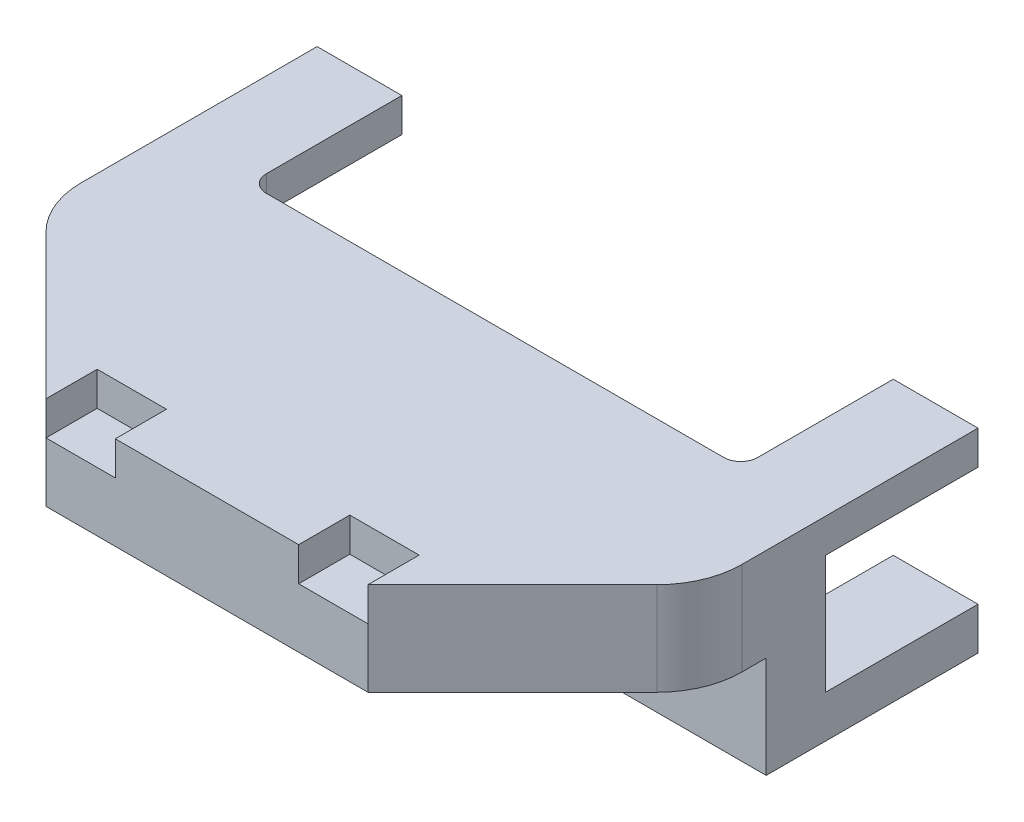
ISO-10303-21;
HEADER;
FILE_DESCRIPTION(('STEP AP214'),'2;1');
FILE_NAME('part.step','',(''),(''),'','','');
FILE_SCHEMA(('AUTOMOTIVE_DESIGN { 1 0 10303 214 1 1 1 1 }'));
ENDSEC;
DATA;
#1=APPLICATION_CONTEXT('core data for automotive mechanical design processes');
#2=APPLICATION_PROTOCOL_DEFINITION('international standard','automotive_design',2000,#1);
#3=PRODUCT_CONTEXT('',#1,'mechanical');
#4=PRODUCT('Part','Part','',(#3));
#5=PRODUCT_RELATED_PRODUCT_CATEGORY('part','',(#4));
#6=PRODUCT_DEFINITION_FORMATION('','',#4);
#7=PRODUCT_DEFINITION_CONTEXT('part definition',#1,'design');
#8=PRODUCT_DEFINITION('design','',#6,#7);
#9=PRODUCT_DEFINITION_SHAPE('','',#8);
#10=(LENGTH_UNIT() NAMED_UNIT(*) SI_UNIT(.MILLI.,.METRE.));
#11=(NAMED_UNIT(*) PLANE_ANGLE_UNIT() SI_UNIT($,.RADIAN.));
#12=(NAMED_UNIT(*) SI_UNIT($,.STERADIAN.) SOLID_ANGLE_UNIT());
#13=UNCERTAINTY_MEASURE_WITH_UNIT(LENGTH_MEASURE(1.E-05),#10,'distance_accuracy_value','');
#14=(GEOMETRIC_REPRESENTATION_CONTEXT(3) GLOBAL_UNCERTAINTY_ASSIGNED_CONTEXT((#13)) GLOBAL_UNIT_ASSIGNED_CONTEXT((#10,
#11,#12)) REPRESENTATION_CONTEXT('',''));
#15=CARTESIAN_POINT('',(0.,0.,0.));
#16=DIRECTION('',(0.,0.,1.));
#17=DIRECTION('',(1.,0.,0.));
#18=AXIS2_PLACEMENT_3D('',#15,#16,#17);
#19=CARTESIAN_POINT('',(34.,0.,4.92893218813449));
#20=DIRECTION('',(0.,1.,0.));
#21=DIRECTION('',(0.,0.,1.));
#22=AXIS2_PLACEMENT_3D('',#19,#20,#21);
#23=CYLINDRICAL_SURFACE('',#22,5.);
#24=DIRECTION('',(0.,-1.,0.));
#25=VECTOR('',#24,1.);
#26=CARTESIAN_POINT('',(39.,0.,4.92893218813449));
#27=LINE('',#26,#25);
#28=CARTESIAN_POINT('',(39.,0.,4.92893218813449));
#29=VERTEX_POINT('',#28);
#30=CARTESIAN_POINT('',(39.,-5.5,4.92893218813449));
#31=VERTEX_POINT('',#30);
#32=EDGE_CURVE('E501',#29,#31,#27,.T.);
#33=ORIENTED_EDGE('',*,*,#32,.F.);
#34=CARTESIAN_POINT('',(34.,0.,4.92893218813449));
#35=DIRECTION('',(0.,-1.,0.));
#36=DIRECTION('',(0.,0.,-1.));
#37=AXIS2_PLACEMENT_3D('',#34,#35,#36);
#38=CIRCLE('',#37,5.);
#39=CARTESIAN_POINT('',(37.5355339059327,0.,8.46446609406723));
#40=VERTEX_POINT('',#39);
#41=EDGE_CURVE('E42',#40,#29,#38,.F.);
#42=ORIENTED_EDGE('',*,*,#41,.F.);
#43=DIRECTION('',(0.,-1.,0.));
#44=VECTOR('',#43,1.);
#45=CARTESIAN_POINT('',(37.5355339059327,0.,8.46446609406722));
#46=LINE('',#45,#44);
#47=CARTESIAN_POINT('',(37.5355339059327,-5.5,8.46446609406723));
#48=VERTEX_POINT('',#47);
#49=EDGE_CURVE('E504',#48,#40,#46,.F.);
#50=ORIENTED_EDGE('',*,*,#49,.F.);
#51=CARTESIAN_POINT('',(34.,-5.5,4.92893218813449));
#52=DIRECTION('',(0.,-1.,0.));
#53=DIRECTION('',(0.,0.,-1.));
#54=AXIS2_PLACEMENT_3D('',#51,#52,#53);
#55=CIRCLE('',#54,5.);
#56=EDGE_CURVE('E11',#31,#48,#55,.T.);
#57=ORIENTED_EDGE('',*,*,#56,.F.);
#58=EDGE_LOOP('',(#33,#42,#50,#57));
#59=FACE_BOUND('',#58,.T.);
#60=ADVANCED_FACE('F35',(#59),#23,.T.);
#61=CARTESIAN_POINT('',(5.,0.,4.9289321881345));
#62=DIRECTION('',(0.,1.,0.));
#63=DIRECTION('',(-1.,0.,0.));
#64=AXIS2_PLACEMENT_3D('',#61,#62,#63);
#65=CYLINDRICAL_SURFACE('',#64,5.);
#66=DIRECTION('',(0.,-1.,0.));
#67=VECTOR('',#66,1.);
#68=CARTESIAN_POINT('',(1.46446609406726,0.,8.46446609406723));
#69=LINE('',#68,#67);
#70=CARTESIAN_POINT('',(1.46446609406726,0.,8.46446609406723));
#71=VERTEX_POINT('',#70);
#72=CARTESIAN_POINT('',(1.46446609406726,-5.5,8.46446609406723));
#73=VERTEX_POINT('',#72);
#74=EDGE_CURVE('E493',#71,#73,#69,.T.);
#75=ORIENTED_EDGE('',*,*,#74,.F.);
#76=CARTESIAN_POINT('',(5.,0.,4.9289321881345));
#77=DIRECTION('',(0.,-1.,0.));
#78=DIRECTION('',(0.,0.,-1.));
#79=AXIS2_PLACEMENT_3D('',#76,#77,#78);
#80=CIRCLE('',#79,5.);
#81=CARTESIAN_POINT('',(0.,0.,4.92893218813449));
#82=VERTEX_POINT('',#81);
#83=EDGE_CURVE('E498',#82,#71,#80,.F.);
#84=ORIENTED_EDGE('',*,*,#83,.F.);
#85=DIRECTION('',(0.,-1.,0.));
#86=VECTOR('',#85,1.);
#87=CARTESIAN_POINT('',(0.,0.,4.9289321881345));
#88=LINE('',#87,#86);
#89=CARTESIAN_POINT('',(0.,-5.5,4.92893218813449));
#90=VERTEX_POINT('',#89);
#91=EDGE_CURVE('E496',#90,#82,#88,.F.);
#92=ORIENTED_EDGE('',*,*,#91,.F.);
#93=CARTESIAN_POINT('',(5.,-5.5,4.9289321881345));
#94=DIRECTION('',(0.,-1.,0.));
#95=DIRECTION('',(0.,0.,-1.));
#96=AXIS2_PLACEMENT_3D('',#93,#94,#95);
#97=CIRCLE('',#96,5.);
#98=EDGE_CURVE('E251',#73,#90,#97,.T.);
#99=ORIENTED_EDGE('',*,*,#98,.F.);
#100=EDGE_LOOP('',(#75,#84,#92,#99));
#101=FACE_BOUND('',#100,.T.);
#102=ADVANCED_FACE('F550',(#101),#65,.T.);
#103=CARTESIAN_POINT('',(0.,0.,17.));
#104=DIRECTION('',(0.,0.,1.));
#105=DIRECTION('',(1.,0.,0.));
#106=AXIS2_PLACEMENT_3D('',#103,#104,#105);
#107=PLANE('',#106);
#108=DIRECTION('',(0.,-1.,0.));
#109=VECTOR('',#108,1.);
#110=CARTESIAN_POINT('',(10.,-11.5,17.));
#111=LINE('',#110,#109);
#112=CARTESIAN_POINT('',(10.,-2.,17.));
#113=VERTEX_POINT('',#112);
#114=CARTESIAN_POINT('',(10.,-5.5,17.));
#115=VERTEX_POINT('',#114);
#116=EDGE_CURVE('E485',#113,#115,#111,.T.);
#117=ORIENTED_EDGE('',*,*,#116,.T.);
#118=DIRECTION('',(1.,0.,0.));
#119=VECTOR('',#118,1.);
#120=CARTESIAN_POINT('',(0.,-5.5,17.));
#121=LINE('',#120,#119);
#122=CARTESIAN_POINT('',(29.,-5.5,17.));
#123=VERTEX_POINT('',#122);
#124=EDGE_CURVE('E269',#115,#123,#121,.T.);
#125=ORIENTED_EDGE('',*,*,#124,.T.);
#126=DIRECTION('',(0.,1.,0.));
#127=VECTOR('',#126,1.);
#128=CARTESIAN_POINT('',(29.,0.,17.));
#129=LINE('',#128,#127);
#130=CARTESIAN_POINT('',(29.,-2.,17.));
#131=VERTEX_POINT('',#130);
#132=EDGE_CURVE('E480',#123,#131,#129,.T.);
#133=ORIENTED_EDGE('',*,*,#132,.T.);
#134=DIRECTION('',(1.,0.,0.));
#135=VECTOR('',#134,1.);
#136=CARTESIAN_POINT('',(29.,-2.,17.));
#137=LINE('',#136,#135);
#138=CARTESIAN_POINT('',(24.91,-2.,17.));
#139=VERTEX_POINT('',#138);
#140=EDGE_CURVE('E291',#139,#131,#137,.T.);
#141=ORIENTED_EDGE('',*,*,#140,.F.);
#142=DIRECTION('',(0.,1.,0.));
#143=VECTOR('',#142,1.);
#144=CARTESIAN_POINT('',(24.91,-2.,17.));
#145=LINE('',#144,#143);
#146=CARTESIAN_POINT('',(24.91,0.,17.));
#147=VERTEX_POINT('',#146);
#148=EDGE_CURVE('E306',#139,#147,#145,.T.);
#149=ORIENTED_EDGE('',*,*,#148,.T.);
#150=DIRECTION('',(-1.,0.,0.));
#151=VECTOR('',#150,1.);
#152=CARTESIAN_POINT('',(0.,0.,17.));
#153=LINE('',#152,#151);
#154=CARTESIAN_POINT('',(14.09,0.,17.));
#155=VERTEX_POINT('',#154);
#156=EDGE_CURVE('E418',#147,#155,#153,.T.);
#157=ORIENTED_EDGE('',*,*,#156,.T.);
#158=DIRECTION('',(0.,1.,0.));
#159=VECTOR('',#158,1.);
#160=CARTESIAN_POINT('',(14.09,-2.,17.));
#161=LINE('',#160,#159);
#162=CARTESIAN_POINT('',(14.09,-2.,17.));
#163=VERTEX_POINT('',#162);
#164=EDGE_CURVE('E325',#163,#155,#161,.T.);
#165=ORIENTED_EDGE('',*,*,#164,.F.);
#166=DIRECTION('',(1.,0.,0.));
#167=VECTOR('',#166,1.);
#168=CARTESIAN_POINT('',(10.,-2.,17.));
#169=LINE('',#168,#167);
#170=EDGE_CURVE('E315',#113,#163,#169,.T.);
#171=ORIENTED_EDGE('',*,*,#170,.F.);
#172=EDGE_LOOP('',(#117,#125,#133,#141,#149,#157,#165,#171));
#173=FACE_BOUND('',#172,.T.);
#174=ADVANCED_FACE('F571',(#173),#107,.T.);
#175=CARTESIAN_POINT('',(29.,0.,17.));
#176=DIRECTION('',(0.707106781186549,0.,0.707106781186546));
#177=DIRECTION('',(0.,-1.,0.));
#178=AXIS2_PLACEMENT_3D('',#175,#176,#177);
#179=PLANE('',#178);
#180=DIRECTION('',(0.707106781186546,0.,-0.707106781186549));
#181=VECTOR('',#180,1.);
#182=CARTESIAN_POINT('',(29.,-5.5,17.));
#183=LINE('',#182,#181);
#184=EDGE_CURVE('E272',#123,#48,#183,.T.);
#185=ORIENTED_EDGE('',*,*,#184,.T.);
#186=ORIENTED_EDGE('',*,*,#49,.T.);
#187=DIRECTION('',(0.707106781186546,0.,-0.707106781186549));
#188=VECTOR('',#187,1.);
#189=CARTESIAN_POINT('',(29.,0.,17.));
#190=LINE('',#189,#188);
#191=CARTESIAN_POINT('',(29.,0.,17.));
#192=VERTEX_POINT('',#191);
#193=EDGE_CURVE('E482',#192,#40,#190,.T.);
#194=ORIENTED_EDGE('',*,*,#193,.F.);
#195=DIRECTION('',(0.,1.,0.));
#196=VECTOR('',#195,1.);
#197=CARTESIAN_POINT('',(29.,-2.,17.));
#198=LINE('',#197,#196);
#199=EDGE_CURVE('E303',#131,#192,#198,.T.);
#200=ORIENTED_EDGE('',*,*,#199,.F.);
#201=ORIENTED_EDGE('',*,*,#132,.F.);
#202=EDGE_LOOP('',(#185,#186,#194,#200,#201));
#203=FACE_BOUND('',#202,.T.);
#204=ADVANCED_FACE('F587',(#203),#179,.T.);
#205=CARTESIAN_POINT('',(10.,0.,17.));
#206=DIRECTION('',(-0.707106781186549,0.,0.707106781186546));
#207=DIRECTION('',(0.,1.,0.));
#208=AXIS2_PLACEMENT_3D('',#205,#206,#207);
#209=PLANE('',#208);
#210=DIRECTION('',(0.707106781186546,0.,0.707106781186549));
#211=VECTOR('',#210,1.);
#212=CARTESIAN_POINT('',(10.,0.,17.));
#213=LINE('',#212,#211);
#214=CARTESIAN_POINT('',(10.,0.,17.));
#215=VERTEX_POINT('',#214);
#216=EDGE_CURVE('E488',#71,#215,#213,.T.);
#217=ORIENTED_EDGE('',*,*,#216,.F.);
#218=ORIENTED_EDGE('',*,*,#74,.T.);
#219=DIRECTION('',(0.707106781186546,0.,0.707106781186549));
#220=VECTOR('',#219,1.);
#221=CARTESIAN_POINT('',(10.,-5.5,17.));
#222=LINE('',#221,#220);
#223=EDGE_CURVE('E490',#73,#115,#222,.T.);
#224=ORIENTED_EDGE('',*,*,#223,.T.);
#225=ORIENTED_EDGE('',*,*,#116,.F.);
#226=EDGE_CURVE('E486',#215,#113,#111,.T.);
#227=ORIENTED_EDGE('',*,*,#226,.F.);
#228=EDGE_LOOP('',(#217,#218,#224,#225,#227));
#229=FACE_BOUND('',#228,.T.);
#230=ADVANCED_FACE('F554',(#229),#209,.T.);
#231=CARTESIAN_POINT('',(6.,-11.5,-0.999999999999999));
#232=DIRECTION('',(0.,1.,0.));
#233=DIRECTION('',(0.,0.,1.));
#234=AXIS2_PLACEMENT_3D('',#231,#232,#233);
#235=CYLINDRICAL_SURFACE('',#234,1.);
#236=DIRECTION('',(0.,-1.,0.));
#237=VECTOR('',#236,1.);
#238=CARTESIAN_POINT('',(5.,-11.5,-0.999999999999999));
#239=LINE('',#238,#237);
#240=CARTESIAN_POINT('',(5.,-9.,-1.));
#241=VERTEX_POINT('',#240);
#242=CARTESIAN_POINT('',(5.,-11.5,-1.));
#243=VERTEX_POINT('',#242);
#244=EDGE_CURVE('E469',#241,#243,#239,.T.);
#245=ORIENTED_EDGE('',*,*,#244,.F.);
#246=CARTESIAN_POINT('',(6.,-9.,-0.999999999999999));
#247=DIRECTION('',(0.,-1.,0.));
#248=DIRECTION('',(1.,0.,0.));
#249=AXIS2_PLACEMENT_3D('',#246,#247,#248);
#250=CIRCLE('',#249,1.);
#251=CARTESIAN_POINT('',(6.,-9.,0.));
#252=VERTEX_POINT('',#251);
#253=EDGE_CURVE('E475',#241,#252,#250,.F.);
#254=ORIENTED_EDGE('',*,*,#253,.T.);
#255=DIRECTION('',(0.,-1.,0.));
#256=VECTOR('',#255,1.);
#257=CARTESIAN_POINT('',(6.,-11.5,0.));
#258=LINE('',#257,#256);
#259=CARTESIAN_POINT('',(6.,-11.5,0.));
#260=VERTEX_POINT('',#259);
#261=EDGE_CURVE('E472',#260,#252,#258,.F.);
#262=ORIENTED_EDGE('',*,*,#261,.F.);
#263=CARTESIAN_POINT('',(6.,-11.5,-0.999999999999999));
#264=DIRECTION('',(0.,1.,0.));
#265=DIRECTION('',(0.,0.,1.));
#266=AXIS2_PLACEMENT_3D('',#263,#264,#265);
#267=CIRCLE('',#266,1.);
#268=EDGE_CURVE('E478',#260,#243,#267,.F.);
#269=ORIENTED_EDGE('',*,*,#268,.T.);
#270=EDGE_LOOP('',(#245,#254,#262,#269));
#271=FACE_BOUND('',#270,.T.);
#272=ADVANCED_FACE('F614',(#271),#235,.F.);
#273=CARTESIAN_POINT('',(33.,-11.5,-0.999999999999999));
#274=DIRECTION('',(0.,-1.,0.));
#275=DIRECTION('',(0.,0.,-1.));
#276=AXIS2_PLACEMENT_3D('',#273,#274,#275);
#277=CYLINDRICAL_SURFACE('',#276,1.);
#278=DIRECTION('',(0.,1.,0.));
#279=VECTOR('',#278,1.);
#280=CARTESIAN_POINT('',(34.,-11.5,-0.999999999999999));
#281=LINE('',#280,#279);
#282=CARTESIAN_POINT('',(34.,-11.5,-1.));
#283=VERTEX_POINT('',#282);
#284=CARTESIAN_POINT('',(34.,-9.,-1.));
#285=VERTEX_POINT('',#284);
#286=EDGE_CURVE('E458',#283,#285,#281,.T.);
#287=ORIENTED_EDGE('',*,*,#286,.F.);
#288=CARTESIAN_POINT('',(33.,-11.5,-0.999999999999999));
#289=DIRECTION('',(0.,1.,0.));
#290=DIRECTION('',(0.,0.,1.));
#291=AXIS2_PLACEMENT_3D('',#288,#289,#290);
#292=CIRCLE('',#291,1.);
#293=CARTESIAN_POINT('',(33.,-11.5,0.));
#294=VERTEX_POINT('',#293);
#295=EDGE_CURVE('E464',#283,#294,#292,.F.);
#296=ORIENTED_EDGE('',*,*,#295,.T.);
#297=DIRECTION('',(0.,1.,0.));
#298=VECTOR('',#297,1.);
#299=CARTESIAN_POINT('',(33.,-11.5,0.));
#300=LINE('',#299,#298);
#301=CARTESIAN_POINT('',(33.,-9.,0.));
#302=VERTEX_POINT('',#301);
#303=EDGE_CURVE('E461',#302,#294,#300,.F.);
#304=ORIENTED_EDGE('',*,*,#303,.F.);
#305=CARTESIAN_POINT('',(33.,-9.,-0.999999999999999));
#306=DIRECTION('',(0.,-1.,0.));
#307=DIRECTION('',(0.,0.,-1.));
#308=AXIS2_PLACEMENT_3D('',#305,#306,#307);
#309=CIRCLE('',#308,1.);
#310=EDGE_CURVE('E467',#302,#285,#309,.F.);
#311=ORIENTED_EDGE('',*,*,#310,.T.);
#312=EDGE_LOOP('',(#287,#296,#304,#311));
#313=FACE_BOUND('',#312,.T.);
#314=ADVANCED_FACE('F619',(#313),#277,.F.);
#315=CARTESIAN_POINT('',(6.,0.,-1.));
#316=DIRECTION('',(0.,-1.,0.));
#317=DIRECTION('',(1.,0.,0.));
#318=AXIS2_PLACEMENT_3D('',#315,#316,#317);
#319=CYLINDRICAL_SURFACE('',#318,1.);
#320=DIRECTION('',(0.,1.,0.));
#321=VECTOR('',#320,1.);
#322=CARTESIAN_POINT('',(6.,0.,0.));
#323=LINE('',#322,#321);
#324=CARTESIAN_POINT('',(6.,-2.,0.));
#325=VERTEX_POINT('',#324);
#326=CARTESIAN_POINT('',(6.,0.,0.));
#327=VERTEX_POINT('',#326);
#328=EDGE_CURVE('E448',#325,#327,#323,.T.);
#329=ORIENTED_EDGE('',*,*,#328,.F.);
#330=CARTESIAN_POINT('',(6.,-2.,-1.));
#331=DIRECTION('',(0.,1.,0.));
#332=DIRECTION('',(-1.,0.,0.));
#333=AXIS2_PLACEMENT_3D('',#330,#331,#332);
#334=CIRCLE('',#333,1.);
#335=CARTESIAN_POINT('',(5.,-2.,-1.));
#336=VERTEX_POINT('',#335);
#337=EDGE_CURVE('E454',#325,#336,#334,.F.);
#338=ORIENTED_EDGE('',*,*,#337,.T.);
#339=DIRECTION('',(0.,1.,0.));
#340=VECTOR('',#339,1.);
#341=CARTESIAN_POINT('',(5.,0.,-1.));
#342=LINE('',#341,#340);
#343=CARTESIAN_POINT('',(5.,0.,-1.));
#344=VERTEX_POINT('',#343);
#345=EDGE_CURVE('E451',#344,#336,#342,.F.);
#346=ORIENTED_EDGE('',*,*,#345,.F.);
#347=CARTESIAN_POINT('',(6.,0.,-1.));
#348=DIRECTION('',(0.,-1.,0.));
#349=DIRECTION('',(0.,0.,-1.));
#350=AXIS2_PLACEMENT_3D('',#347,#348,#349);
#351=CIRCLE('',#350,1.);
#352=EDGE_CURVE('E456',#344,#327,#351,.F.);
#353=ORIENTED_EDGE('',*,*,#352,.T.);
#354=EDGE_LOOP('',(#329,#338,#346,#353));
#355=FACE_BOUND('',#354,.T.);
#356=ADVANCED_FACE('F537',(#355),#319,.F.);
#357=CARTESIAN_POINT('',(33.,0.,-0.999999999999999));
#358=DIRECTION('',(0.,-1.,0.));
#359=DIRECTION('',(0.,0.,-1.));
#360=AXIS2_PLACEMENT_3D('',#357,#358,#359);
#361=CYLINDRICAL_SURFACE('',#360,1.);
#362=DIRECTION('',(0.,1.,0.));
#363=VECTOR('',#362,1.);
#364=CARTESIAN_POINT('',(34.,0.,-0.999999999999999));
#365=LINE('',#364,#363);
#366=CARTESIAN_POINT('',(34.,-2.,-1.));
#367=VERTEX_POINT('',#366);
#368=CARTESIAN_POINT('',(34.,0.,-1.));
#369=VERTEX_POINT('',#368);
#370=EDGE_CURVE('E437',#367,#369,#365,.T.);
#371=ORIENTED_EDGE('',*,*,#370,.F.);
#372=CARTESIAN_POINT('',(33.,-2.,-0.999999999999999));
#373=DIRECTION('',(0.,1.,0.));
#374=DIRECTION('',(0.,0.,1.));
#375=AXIS2_PLACEMENT_3D('',#372,#373,#374);
#376=CIRCLE('',#375,1.);
#377=CARTESIAN_POINT('',(33.,-2.,0.));
#378=VERTEX_POINT('',#377);
#379=EDGE_CURVE('E443',#367,#378,#376,.F.);
#380=ORIENTED_EDGE('',*,*,#379,.T.);
#381=DIRECTION('',(0.,1.,0.));
#382=VECTOR('',#381,1.);
#383=CARTESIAN_POINT('',(33.,0.,0.));
#384=LINE('',#383,#382);
#385=CARTESIAN_POINT('',(33.,0.,0.));
#386=VERTEX_POINT('',#385);
#387=EDGE_CURVE('E440',#386,#378,#384,.F.);
#388=ORIENTED_EDGE('',*,*,#387,.F.);
#389=CARTESIAN_POINT('',(33.,0.,-0.999999999999999));
#390=DIRECTION('',(0.,-1.,0.));
#391=DIRECTION('',(0.,0.,-1.));
#392=AXIS2_PLACEMENT_3D('',#389,#390,#391);
#393=CIRCLE('',#392,1.);
#394=EDGE_CURVE('E446',#386,#369,#393,.F.);
#395=ORIENTED_EDGE('',*,*,#394,.T.);
#396=EDGE_LOOP('',(#371,#380,#388,#395));
#397=FACE_BOUND('',#396,.T.);
#398=ADVANCED_FACE('F525',(#397),#361,.F.);
#399=CARTESIAN_POINT('',(0.,0.,0.));
#400=DIRECTION('',(0.,0.,1.));
#401=DIRECTION('',(1.,0.,0.));
#402=AXIS2_PLACEMENT_3D('',#399,#400,#401);
#403=PLANE('',#402);
#404=DIRECTION('',(1.,0.,0.));
#405=VECTOR('',#404,1.);
#406=CARTESIAN_POINT('',(0.,-11.5,0.));
#407=LINE('',#406,#405);
#408=EDGE_CURVE('E424',#260,#294,#407,.T.);
#409=ORIENTED_EDGE('',*,*,#408,.F.);
#410=ORIENTED_EDGE('',*,*,#261,.T.);
#411=DIRECTION('',(1.,0.,0.));
#412=VECTOR('',#411,1.);
#413=CARTESIAN_POINT('',(0.,-9.,0.));
#414=LINE('',#413,#412);
#415=CARTESIAN_POINT('',(0.,-9.,0.));
#416=VERTEX_POINT('',#415);
#417=EDGE_CURVE('E396',#416,#252,#414,.T.);
#418=ORIENTED_EDGE('',*,*,#417,.F.);
#419=DIRECTION('',(0.,-1.,0.));
#420=VECTOR('',#419,1.);
#421=CARTESIAN_POINT('',(0.,0.,0.));
#422=LINE('',#421,#420);
#423=CARTESIAN_POINT('',(0.,-2.,0.));
#424=VERTEX_POINT('',#423);
#425=EDGE_CURVE('E417',#424,#416,#422,.T.);
#426=ORIENTED_EDGE('',*,*,#425,.F.);
#427=DIRECTION('',(-1.,0.,0.));
#428=VECTOR('',#427,1.);
#429=CARTESIAN_POINT('',(0.,-2.,0.));
#430=LINE('',#429,#428);
#431=EDGE_CURVE('E376',#325,#424,#430,.T.);
#432=ORIENTED_EDGE('',*,*,#431,.F.);
#433=ORIENTED_EDGE('',*,*,#328,.T.);
#434=DIRECTION('',(-1.,0.,0.));
#435=VECTOR('',#434,1.);
#436=CARTESIAN_POINT('',(0.,0.,0.));
#437=LINE('',#436,#435);
#438=EDGE_CURVE('E422',#386,#327,#437,.T.);
#439=ORIENTED_EDGE('',*,*,#438,.F.);
#440=ORIENTED_EDGE('',*,*,#387,.T.);
#441=DIRECTION('',(-1.,0.,0.));
#442=VECTOR('',#441,1.);
#443=CARTESIAN_POINT('',(39.,-2.,0.));
#444=LINE('',#443,#442);
#445=CARTESIAN_POINT('',(39.,-2.,0.));
#446=VERTEX_POINT('',#445);
#447=EDGE_CURVE('E305',#446,#378,#444,.T.);
#448=ORIENTED_EDGE('',*,*,#447,.F.);
#449=DIRECTION('',(0.,1.,0.));
#450=VECTOR('',#449,1.);
#451=CARTESIAN_POINT('',(39.,0.,0.));
#452=LINE('',#451,#450);
#453=CARTESIAN_POINT('',(39.,-9.,0.));
#454=VERTEX_POINT('',#453);
#455=EDGE_CURVE('E426',#454,#446,#452,.T.);
#456=ORIENTED_EDGE('',*,*,#455,.F.);
#457=DIRECTION('',(1.,0.,0.));
#458=VECTOR('',#457,1.);
#459=CARTESIAN_POINT('',(39.,-9.,0.));
#460=LINE('',#459,#458);
#461=EDGE_CURVE('E356',#302,#454,#460,.T.);
#462=ORIENTED_EDGE('',*,*,#461,.F.);
#463=ORIENTED_EDGE('',*,*,#303,.T.);
#464=EDGE_LOOP('',(#409,#410,#418,#426,#432,#433,#439,#440,#448,#456,#462,#463));
#465=FACE_BOUND('',#464,.T.);
#466=ADVANCED_FACE('F530',(#465),#403,.F.);
#467=CARTESIAN_POINT('',(0.,0.,17.));
#468=DIRECTION('',(1.,0.,0.));
#469=DIRECTION('',(0.,1.,0.));
#470=AXIS2_PLACEMENT_3D('',#467,#468,#469);
#471=PLANE('',#470);
#472=DIRECTION('',(0.,0.,1.));
#473=VECTOR('',#472,1.);
#474=CARTESIAN_POINT('',(0.,-5.5,3.5));
#475=LINE('',#474,#473);
#476=CARTESIAN_POINT('',(0.,-5.5,3.5));
#477=VERTEX_POINT('',#476);
#478=EDGE_CURVE('E245',#477,#90,#475,.T.);
#479=ORIENTED_EDGE('',*,*,#478,.T.);
#480=ORIENTED_EDGE('',*,*,#91,.T.);
#481=DIRECTION('',(0.,0.,-1.));
#482=VECTOR('',#481,1.);
#483=CARTESIAN_POINT('',(0.,0.,17.));
#484=LINE('',#483,#482);
#485=CARTESIAN_POINT('',(0.,0.,-9.));
#486=VERTEX_POINT('',#485);
#487=EDGE_CURVE('E421',#82,#486,#484,.T.);
#488=ORIENTED_EDGE('',*,*,#487,.T.);
#489=DIRECTION('',(0.,1.,0.));
#490=VECTOR('',#489,1.);
#491=CARTESIAN_POINT('',(0.,0.,-9.));
#492=LINE('',#491,#490);
#493=CARTESIAN_POINT('',(0.,-2.,-9.));
#494=VERTEX_POINT('',#493);
#495=EDGE_CURVE('E377',#494,#486,#492,.T.);
#496=ORIENTED_EDGE('',*,*,#495,.F.);
#497=DIRECTION('',(0.,0.,1.));
#498=VECTOR('',#497,1.);
#499=CARTESIAN_POINT('',(0.,-2.,-9.));
#500=LINE('',#499,#498);
#501=EDGE_CURVE('E386',#494,#424,#500,.T.);
#502=ORIENTED_EDGE('',*,*,#501,.T.);
#503=ORIENTED_EDGE('',*,*,#425,.T.);
#504=DIRECTION('',(0.,0.,1.));
#505=VECTOR('',#504,1.);
#506=CARTESIAN_POINT('',(0.,-9.,-9.));
#507=LINE('',#506,#505);
#508=CARTESIAN_POINT('',(0.,-9.,-9.));
#509=VERTEX_POINT('',#508);
#510=EDGE_CURVE('E414',#509,#416,#507,.T.);
#511=ORIENTED_EDGE('',*,*,#510,.F.);
#512=DIRECTION('',(0.,1.,0.));
#513=VECTOR('',#512,1.);
#514=CARTESIAN_POINT('',(0.,-11.5,-9.));
#515=LINE('',#514,#513);
#516=CARTESIAN_POINT('',(0.,-11.5,-9.));
#517=VERTEX_POINT('',#516);
#518=EDGE_CURVE('E397',#517,#509,#515,.T.);
#519=ORIENTED_EDGE('',*,*,#518,.F.);
#520=DIRECTION('',(0.,0.,-1.));
#521=VECTOR('',#520,1.);
#522=CARTESIAN_POINT('',(0.,-11.5,17.));
#523=LINE('',#522,#521);
#524=CARTESIAN_POINT('',(0.,-11.5,3.5));
#525=VERTEX_POINT('',#524);
#526=EDGE_CURVE('E268',#525,#517,#523,.T.);
#527=ORIENTED_EDGE('',*,*,#526,.F.);
#528=DIRECTION('',(0.,-1.,0.));
#529=VECTOR('',#528,1.);
#530=CARTESIAN_POINT('',(0.,-5.5,3.5));
#531=LINE('',#530,#529);
#532=EDGE_CURVE('E256',#477,#525,#531,.T.);
#533=ORIENTED_EDGE('',*,*,#532,.F.);
#534=EDGE_LOOP('',(#479,#480,#488,#496,#502,#503,#511,#519,#527,#533));
#535=FACE_BOUND('',#534,.T.);
#536=ADVANCED_FACE('F266',(#535),#471,.F.);
#537=CARTESIAN_POINT('',(0.,-11.5,17.));
#538=DIRECTION('',(0.,1.,0.));
#539=DIRECTION('',(0.,0.,1.));
#540=AXIS2_PLACEMENT_3D('',#537,#538,#539);
#541=PLANE('',#540);
#542=DIRECTION('',(0.,0.,-1.));
#543=VECTOR('',#542,1.);
#544=CARTESIAN_POINT('',(39.,-11.5,17.));
#545=LINE('',#544,#543);
#546=CARTESIAN_POINT('',(39.,-11.5,3.5));
#547=VERTEX_POINT('',#546);
#548=CARTESIAN_POINT('',(39.,-11.5,-9.));
#549=VERTEX_POINT('',#548);
#550=EDGE_CURVE('E434',#547,#549,#545,.T.);
#551=ORIENTED_EDGE('',*,*,#550,.F.);
#552=DIRECTION('',(1.,0.,0.));
#553=VECTOR('',#552,1.);
#554=CARTESIAN_POINT('',(0.,-11.5,3.5));
#555=LINE('',#554,#553);
#556=EDGE_CURVE('E263',#525,#547,#555,.T.);
#557=ORIENTED_EDGE('',*,*,#556,.F.);
#558=ORIENTED_EDGE('',*,*,#526,.T.);
#559=DIRECTION('',(-1.,0.,0.));
#560=VECTOR('',#559,1.);
#561=CARTESIAN_POINT('',(0.,-11.5,-9.));
#562=LINE('',#561,#560);
#563=CARTESIAN_POINT('',(5.,-11.5,-9.));
#564=VERTEX_POINT('',#563);
#565=EDGE_CURVE('E404',#564,#517,#562,.T.);
#566=ORIENTED_EDGE('',*,*,#565,.F.);
#567=DIRECTION('',(0.,0.,1.));
#568=VECTOR('',#567,1.);
#569=CARTESIAN_POINT('',(5.,-11.5,-9.));
#570=LINE('',#569,#568);
#571=EDGE_CURVE('E407',#564,#243,#570,.T.);
#572=ORIENTED_EDGE('',*,*,#571,.T.);
#573=ORIENTED_EDGE('',*,*,#268,.F.);
#574=ORIENTED_EDGE('',*,*,#408,.T.);
#575=ORIENTED_EDGE('',*,*,#295,.F.);
#576=DIRECTION('',(0.,0.,1.));
#577=VECTOR('',#576,1.);
#578=CARTESIAN_POINT('',(34.,-11.5,-9.));
#579=LINE('',#578,#577);
#580=CARTESIAN_POINT('',(34.,-11.5,-9.));
#581=VERTEX_POINT('',#580);
#582=EDGE_CURVE('E373',#581,#283,#579,.T.);
#583=ORIENTED_EDGE('',*,*,#582,.F.);
#584=DIRECTION('',(-1.,0.,0.));
#585=VECTOR('',#584,1.);
#586=CARTESIAN_POINT('',(39.,-11.5,-9.));
#587=LINE('',#586,#585);
#588=EDGE_CURVE('E360',#549,#581,#587,.T.);
#589=ORIENTED_EDGE('',*,*,#588,.F.);
#590=EDGE_LOOP('',(#551,#557,#558,#566,#572,#573,#574,#575,#583,#589));
#591=FACE_BOUND('',#590,.T.);
#592=ADVANCED_FACE('F630',(#591),#541,.F.);
#593=CARTESIAN_POINT('',(39.,0.,17.));
#594=DIRECTION('',(-1.,0.,0.));
#595=DIRECTION('',(0.,0.,1.));
#596=AXIS2_PLACEMENT_3D('',#593,#594,#595);
#597=PLANE('',#596);
#598=DIRECTION('',(0.,0.,-1.));
#599=VECTOR('',#598,1.);
#600=CARTESIAN_POINT('',(39.,0.,17.));
#601=LINE('',#600,#599);
#602=CARTESIAN_POINT('',(39.,0.,-9.));
#603=VERTEX_POINT('',#602);
#604=EDGE_CURVE('E432',#29,#603,#601,.T.);
#605=ORIENTED_EDGE('',*,*,#604,.F.);
#606=ORIENTED_EDGE('',*,*,#32,.T.);
#607=DIRECTION('',(0.,0.,1.));
#608=VECTOR('',#607,1.);
#609=CARTESIAN_POINT('',(39.,-5.5,17.));
#610=LINE('',#609,#608);
#611=CARTESIAN_POINT('',(39.,-5.5,3.5));
#612=VERTEX_POINT('',#611);
#613=EDGE_CURVE('E278',#612,#31,#610,.T.);
#614=ORIENTED_EDGE('',*,*,#613,.F.);
#615=DIRECTION('',(0.,-1.,0.));
#616=VECTOR('',#615,1.);
#617=CARTESIAN_POINT('',(39.,0.,3.5));
#618=LINE('',#617,#616);
#619=EDGE_CURVE('E262',#612,#547,#618,.T.);
#620=ORIENTED_EDGE('',*,*,#619,.T.);
#621=ORIENTED_EDGE('',*,*,#550,.T.);
#622=DIRECTION('',(0.,-1.,0.));
#623=VECTOR('',#622,1.);
#624=CARTESIAN_POINT('',(39.,-11.5,-9.));
#625=LINE('',#624,#623);
#626=CARTESIAN_POINT('',(39.,-9.,-9.));
#627=VERTEX_POINT('',#626);
#628=EDGE_CURVE('E357',#627,#549,#625,.T.);
#629=ORIENTED_EDGE('',*,*,#628,.F.);
#630=DIRECTION('',(0.,0.,1.));
#631=VECTOR('',#630,1.);
#632=CARTESIAN_POINT('',(39.,-9.,-9.));
#633=LINE('',#632,#631);
#634=EDGE_CURVE('E366',#627,#454,#633,.T.);
#635=ORIENTED_EDGE('',*,*,#634,.T.);
#636=ORIENTED_EDGE('',*,*,#455,.T.);
#637=DIRECTION('',(0.,0.,1.));
#638=VECTOR('',#637,1.);
#639=CARTESIAN_POINT('',(39.,-2.,-9.));
#640=LINE('',#639,#638);
#641=CARTESIAN_POINT('',(39.,-2.,-9.));
#642=VERTEX_POINT('',#641);
#643=EDGE_CURVE('E354',#642,#446,#640,.T.);
#644=ORIENTED_EDGE('',*,*,#643,.F.);
#645=DIRECTION('',(0.,-1.,0.));
#646=VECTOR('',#645,1.);
#647=CARTESIAN_POINT('',(39.,0.,-9.));
#648=LINE('',#647,#646);
#649=EDGE_CURVE('E337',#603,#642,#648,.T.);
#650=ORIENTED_EDGE('',*,*,#649,.F.);
#651=EDGE_LOOP('',(#605,#606,#614,#620,#621,#629,#635,#636,#644,#650));
#652=FACE_BOUND('',#651,.T.);
#653=ADVANCED_FACE('F513',(#652),#597,.F.);
#654=CARTESIAN_POINT('',(0.,0.,17.));
#655=DIRECTION('',(0.,-1.,0.));
#656=DIRECTION('',(0.,0.,-1.));
#657=AXIS2_PLACEMENT_3D('',#654,#655,#656);
#658=PLANE('',#657);
#659=ORIENTED_EDGE('',*,*,#193,.T.);
#660=ORIENTED_EDGE('',*,*,#41,.T.);
#661=ORIENTED_EDGE('',*,*,#604,.T.);
#662=DIRECTION('',(1.,0.,0.));
#663=VECTOR('',#662,1.);
#664=CARTESIAN_POINT('',(39.,0.,-9.));
#665=LINE('',#664,#663);
#666=CARTESIAN_POINT('',(34.,0.,-9.));
#667=VERTEX_POINT('',#666);
#668=EDGE_CURVE('E344',#667,#603,#665,.T.);
#669=ORIENTED_EDGE('',*,*,#668,.F.);
#670=DIRECTION('',(0.,0.,1.));
#671=VECTOR('',#670,1.);
#672=CARTESIAN_POINT('',(34.,0.,-9.));
#673=LINE('',#672,#671);
#674=EDGE_CURVE('E347',#667,#369,#673,.T.);
#675=ORIENTED_EDGE('',*,*,#674,.T.);
#676=ORIENTED_EDGE('',*,*,#394,.F.);
#677=ORIENTED_EDGE('',*,*,#438,.T.);
#678=ORIENTED_EDGE('',*,*,#352,.F.);
#679=DIRECTION('',(0.,0.,1.));
#680=VECTOR('',#679,1.);
#681=CARTESIAN_POINT('',(5.,0.,-9.));
#682=LINE('',#681,#680);
#683=CARTESIAN_POINT('',(5.,0.,-9.));
#684=VERTEX_POINT('',#683);
#685=EDGE_CURVE('E393',#684,#344,#682,.T.);
#686=ORIENTED_EDGE('',*,*,#685,.F.);
#687=DIRECTION('',(1.,0.,0.));
#688=VECTOR('',#687,1.);
#689=CARTESIAN_POINT('',(0.,0.,-9.));
#690=LINE('',#689,#688);
#691=EDGE_CURVE('E380',#486,#684,#690,.T.);
#692=ORIENTED_EDGE('',*,*,#691,.F.);
#693=ORIENTED_EDGE('',*,*,#487,.F.);
#694=ORIENTED_EDGE('',*,*,#83,.T.);
#695=ORIENTED_EDGE('',*,*,#216,.T.);
#696=DIRECTION('',(0.,0.,1.));
#697=VECTOR('',#696,1.);
#698=CARTESIAN_POINT('',(10.,0.,17.));
#699=LINE('',#698,#697);
#700=CARTESIAN_POINT('',(10.,0.,13.98));
#701=VERTEX_POINT('',#700);
#702=EDGE_CURVE('E280',#701,#215,#699,.T.);
#703=ORIENTED_EDGE('',*,*,#702,.F.);
#704=DIRECTION('',(-1.,0.,0.));
#705=VECTOR('',#704,1.);
#706=CARTESIAN_POINT('',(10.,0.,13.98));
#707=LINE('',#706,#705);
#708=CARTESIAN_POINT('',(14.09,0.,13.98));
#709=VERTEX_POINT('',#708);
#710=EDGE_CURVE('E316',#709,#701,#707,.T.);
#711=ORIENTED_EDGE('',*,*,#710,.F.);
#712=DIRECTION('',(0.,0.,-1.));
#713=VECTOR('',#712,1.);
#714=CARTESIAN_POINT('',(14.09,0.,17.));
#715=LINE('',#714,#713);
#716=EDGE_CURVE('E328',#155,#709,#715,.T.);
#717=ORIENTED_EDGE('',*,*,#716,.F.);
#718=ORIENTED_EDGE('',*,*,#156,.F.);
#719=DIRECTION('',(0.,0.,1.));
#720=VECTOR('',#719,1.);
#721=CARTESIAN_POINT('',(24.91,0.,17.));
#722=LINE('',#721,#720);
#723=CARTESIAN_POINT('',(24.91,0.,13.98));
#724=VERTEX_POINT('',#723);
#725=EDGE_CURVE('E285',#724,#147,#722,.T.);
#726=ORIENTED_EDGE('',*,*,#725,.F.);
#727=DIRECTION('',(-1.,0.,0.));
#728=VECTOR('',#727,1.);
#729=CARTESIAN_POINT('',(29.,0.,13.98));
#730=LINE('',#729,#728);
#731=CARTESIAN_POINT('',(29.,0.,13.98));
#732=VERTEX_POINT('',#731);
#733=EDGE_CURVE('E298',#732,#724,#730,.T.);
#734=ORIENTED_EDGE('',*,*,#733,.F.);
#735=DIRECTION('',(0.,0.,-1.));
#736=VECTOR('',#735,1.);
#737=CARTESIAN_POINT('',(29.,0.,17.));
#738=LINE('',#737,#736);
#739=EDGE_CURVE('E295',#192,#732,#738,.T.);
#740=ORIENTED_EDGE('',*,*,#739,.F.);
#741=EDGE_LOOP('',(#659,#660,#661,#669,#675,#676,#677,#678,#686,#692,#693,#694,#695,#703,#711,
#717,#718,#726,#734,#740));
#742=FACE_BOUND('',#741,.T.);
#743=ADVANCED_FACE('F506',(#742),#658,.F.);
#744=CARTESIAN_POINT('',(0.,-9.,-9.));
#745=DIRECTION('',(0.,-1.,0.));
#746=DIRECTION('',(1.,0.,0.));
#747=AXIS2_PLACEMENT_3D('',#744,#745,#746);
#748=PLANE('',#747);
#749=ORIENTED_EDGE('',*,*,#417,.T.);
#750=ORIENTED_EDGE('',*,*,#253,.F.);
#751=DIRECTION('',(0.,0.,1.));
#752=VECTOR('',#751,1.);
#753=CARTESIAN_POINT('',(5.,-9.,-9.));
#754=LINE('',#753,#752);
#755=CARTESIAN_POINT('',(5.,-9.,-9.));
#756=VERTEX_POINT('',#755);
#757=EDGE_CURVE('E411',#756,#241,#754,.T.);
#758=ORIENTED_EDGE('',*,*,#757,.F.);
#759=DIRECTION('',(1.,0.,0.));
#760=VECTOR('',#759,1.);
#761=CARTESIAN_POINT('',(0.,-9.,-9.));
#762=LINE('',#761,#760);
#763=EDGE_CURVE('E400',#509,#756,#762,.T.);
#764=ORIENTED_EDGE('',*,*,#763,.F.);
#765=ORIENTED_EDGE('',*,*,#510,.T.);
#766=EDGE_LOOP('',(#749,#750,#758,#764,#765));
#767=FACE_BOUND('',#766,.T.);
#768=ADVANCED_FACE('F638',(#767),#748,.F.);
#769=CARTESIAN_POINT('',(5.,-11.5,-9.));
#770=DIRECTION('',(-1.,0.,0.));
#771=DIRECTION('',(0.,0.,1.));
#772=AXIS2_PLACEMENT_3D('',#769,#770,#771);
#773=PLANE('',#772);
#774=ORIENTED_EDGE('',*,*,#757,.T.);
#775=ORIENTED_EDGE('',*,*,#244,.T.);
#776=ORIENTED_EDGE('',*,*,#571,.F.);
#777=DIRECTION('',(0.,-1.,0.));
#778=VECTOR('',#777,1.);
#779=CARTESIAN_POINT('',(5.,-11.5,-9.));
#780=LINE('',#779,#778);
#781=EDGE_CURVE('E402',#756,#564,#780,.T.);
#782=ORIENTED_EDGE('',*,*,#781,.F.);
#783=EDGE_LOOP('',(#774,#775,#776,#782));
#784=FACE_BOUND('',#783,.T.);
#785=ADVANCED_FACE('F643',(#784),#773,.F.);
#786=CARTESIAN_POINT('',(0.,0.,-9.));
#787=DIRECTION('',(0.,0.,-1.));
#788=DIRECTION('',(-1.,0.,0.));
#789=AXIS2_PLACEMENT_3D('',#786,#787,#788);
#790=PLANE('',#789);
#791=ORIENTED_EDGE('',*,*,#518,.T.);
#792=ORIENTED_EDGE('',*,*,#763,.T.);
#793=ORIENTED_EDGE('',*,*,#781,.T.);
#794=ORIENTED_EDGE('',*,*,#565,.T.);
#795=EDGE_LOOP('',(#791,#792,#793,#794));
#796=FACE_BOUND('',#795,.T.);
#797=ADVANCED_FACE('F647',(#796),#790,.T.);
#798=CARTESIAN_POINT('',(5.,0.,-9.));
#799=DIRECTION('',(-1.,0.,0.));
#800=DIRECTION('',(0.,-1.,0.));
#801=AXIS2_PLACEMENT_3D('',#798,#799,#800);
#802=PLANE('',#801);
#803=ORIENTED_EDGE('',*,*,#685,.T.);
#804=ORIENTED_EDGE('',*,*,#345,.T.);
#805=DIRECTION('',(0.,0.,1.));
#806=VECTOR('',#805,1.);
#807=CARTESIAN_POINT('',(5.,-2.,-9.));
#808=LINE('',#807,#806);
#809=CARTESIAN_POINT('',(5.,-2.,-9.));
#810=VERTEX_POINT('',#809);
#811=EDGE_CURVE('E390',#810,#336,#808,.T.);
#812=ORIENTED_EDGE('',*,*,#811,.F.);
#813=DIRECTION('',(0.,-1.,0.));
#814=VECTOR('',#813,1.);
#815=CARTESIAN_POINT('',(5.,0.,-9.));
#816=LINE('',#815,#814);
#817=EDGE_CURVE('E382',#684,#810,#816,.T.);
#818=ORIENTED_EDGE('',*,*,#817,.F.);
#819=EDGE_LOOP('',(#803,#804,#812,#818));
#820=FACE_BOUND('',#819,.T.);
#821=ADVANCED_FACE('F541',(#820),#802,.F.);
#822=CARTESIAN_POINT('',(0.,-2.,-9.));
#823=DIRECTION('',(0.,1.,0.));
#824=DIRECTION('',(-1.,0.,0.));
#825=AXIS2_PLACEMENT_3D('',#822,#823,#824);
#826=PLANE('',#825);
#827=ORIENTED_EDGE('',*,*,#431,.T.);
#828=ORIENTED_EDGE('',*,*,#501,.F.);
#829=DIRECTION('',(-1.,0.,0.));
#830=VECTOR('',#829,1.);
#831=CARTESIAN_POINT('',(0.,-2.,-9.));
#832=LINE('',#831,#830);
#833=EDGE_CURVE('E384',#810,#494,#832,.T.);
#834=ORIENTED_EDGE('',*,*,#833,.F.);
#835=ORIENTED_EDGE('',*,*,#811,.T.);
#836=ORIENTED_EDGE('',*,*,#337,.F.);
#837=EDGE_LOOP('',(#827,#828,#834,#835,#836));
#838=FACE_BOUND('',#837,.T.);
#839=ADVANCED_FACE('F654',(#838),#826,.F.);
#840=CARTESIAN_POINT('',(0.,0.,-9.));
#841=DIRECTION('',(0.,0.,1.));
#842=DIRECTION('',(1.,0.,0.));
#843=AXIS2_PLACEMENT_3D('',#840,#841,#842);
#844=PLANE('',#843);
#845=ORIENTED_EDGE('',*,*,#495,.T.);
#846=ORIENTED_EDGE('',*,*,#691,.T.);
#847=ORIENTED_EDGE('',*,*,#817,.T.);
#848=ORIENTED_EDGE('',*,*,#833,.T.);
#849=EDGE_LOOP('',(#845,#846,#847,#848));
#850=FACE_BOUND('',#849,.T.);
#851=ADVANCED_FACE('F544',(#850),#844,.F.);
#852=CARTESIAN_POINT('',(34.,-11.5,-9.));
#853=DIRECTION('',(1.,0.,0.));
#854=DIRECTION('',(0.,0.,-1.));
#855=AXIS2_PLACEMENT_3D('',#852,#853,#854);
#856=PLANE('',#855);
#857=ORIENTED_EDGE('',*,*,#582,.T.);
#858=ORIENTED_EDGE('',*,*,#286,.T.);
#859=DIRECTION('',(0.,0.,1.));
#860=VECTOR('',#859,1.);
#861=CARTESIAN_POINT('',(34.,-9.,-9.));
#862=LINE('',#861,#860);
#863=CARTESIAN_POINT('',(34.,-9.,-9.));
#864=VERTEX_POINT('',#863);
#865=EDGE_CURVE('E370',#864,#285,#862,.T.);
#866=ORIENTED_EDGE('',*,*,#865,.F.);
#867=DIRECTION('',(0.,1.,0.));
#868=VECTOR('',#867,1.);
#869=CARTESIAN_POINT('',(34.,-11.5,-9.));
#870=LINE('',#869,#868);
#871=EDGE_CURVE('E362',#581,#864,#870,.T.);
#872=ORIENTED_EDGE('',*,*,#871,.F.);
#873=EDGE_LOOP('',(#857,#858,#866,#872));
#874=FACE_BOUND('',#873,.T.);
#875=ADVANCED_FACE('F660',(#874),#856,.F.);
#876=CARTESIAN_POINT('',(39.,-9.,-9.));
#877=DIRECTION('',(0.,-1.,0.));
#878=DIRECTION('',(0.,0.,-1.));
#879=AXIS2_PLACEMENT_3D('',#876,#877,#878);
#880=PLANE('',#879);
#881=ORIENTED_EDGE('',*,*,#461,.T.);
#882=ORIENTED_EDGE('',*,*,#634,.F.);
#883=DIRECTION('',(1.,0.,0.));
#884=VECTOR('',#883,1.);
#885=CARTESIAN_POINT('',(39.,-9.,-9.));
#886=LINE('',#885,#884);
#887=EDGE_CURVE('E364',#864,#627,#886,.T.);
#888=ORIENTED_EDGE('',*,*,#887,.F.);
#889=ORIENTED_EDGE('',*,*,#865,.T.);
#890=ORIENTED_EDGE('',*,*,#310,.F.);
#891=EDGE_LOOP('',(#881,#882,#888,#889,#890));
#892=FACE_BOUND('',#891,.T.);
#893=ADVANCED_FACE('F663',(#892),#880,.F.);
#894=CARTESIAN_POINT('',(0.,0.,-9.));
#895=DIRECTION('',(0.,0.,1.));
#896=DIRECTION('',(1.,0.,0.));
#897=AXIS2_PLACEMENT_3D('',#894,#895,#896);
#898=PLANE('',#897);
#899=ORIENTED_EDGE('',*,*,#628,.T.);
#900=ORIENTED_EDGE('',*,*,#588,.T.);
#901=ORIENTED_EDGE('',*,*,#871,.T.);
#902=ORIENTED_EDGE('',*,*,#887,.T.);
#903=EDGE_LOOP('',(#899,#900,#901,#902));
#904=FACE_BOUND('',#903,.T.);
#905=ADVANCED_FACE('F667',(#904),#898,.F.);
#906=CARTESIAN_POINT('',(39.,-2.,-9.));
#907=DIRECTION('',(0.,1.,0.));
#908=DIRECTION('',(0.,0.,1.));
#909=AXIS2_PLACEMENT_3D('',#906,#907,#908);
#910=PLANE('',#909);
#911=ORIENTED_EDGE('',*,*,#447,.T.);
#912=ORIENTED_EDGE('',*,*,#379,.F.);
#913=DIRECTION('',(0.,0.,1.));
#914=VECTOR('',#913,1.);
#915=CARTESIAN_POINT('',(34.,-2.,-9.));
#916=LINE('',#915,#914);
#917=CARTESIAN_POINT('',(34.,-2.,-9.));
#918=VERTEX_POINT('',#917);
#919=EDGE_CURVE('E351',#918,#367,#916,.T.);
#920=ORIENTED_EDGE('',*,*,#919,.F.);
#921=DIRECTION('',(-1.,0.,0.));
#922=VECTOR('',#921,1.);
#923=CARTESIAN_POINT('',(39.,-2.,-9.));
#924=LINE('',#923,#922);
#925=EDGE_CURVE('E340',#642,#918,#924,.T.);
#926=ORIENTED_EDGE('',*,*,#925,.F.);
#927=ORIENTED_EDGE('',*,*,#643,.T.);
#928=EDGE_LOOP('',(#911,#912,#920,#926,#927));
#929=FACE_BOUND('',#928,.T.);
#930=ADVANCED_FACE('F671',(#929),#910,.F.);
#931=CARTESIAN_POINT('',(34.,0.,-9.));
#932=DIRECTION('',(1.,0.,0.));
#933=DIRECTION('',(0.,0.,-1.));
#934=AXIS2_PLACEMENT_3D('',#931,#932,#933);
#935=PLANE('',#934);
#936=ORIENTED_EDGE('',*,*,#919,.T.);
#937=ORIENTED_EDGE('',*,*,#370,.T.);
#938=ORIENTED_EDGE('',*,*,#674,.F.);
#939=DIRECTION('',(0.,1.,0.));
#940=VECTOR('',#939,1.);
#941=CARTESIAN_POINT('',(34.,0.,-9.));
#942=LINE('',#941,#940);
#943=EDGE_CURVE('E342',#918,#667,#942,.T.);
#944=ORIENTED_EDGE('',*,*,#943,.F.);
#945=EDGE_LOOP('',(#936,#937,#938,#944));
#946=FACE_BOUND('',#945,.T.);
#947=ADVANCED_FACE('F522',(#946),#935,.F.);
#948=CARTESIAN_POINT('',(0.,0.,-9.));
#949=DIRECTION('',(0.,0.,-1.));
#950=DIRECTION('',(-1.,0.,0.));
#951=AXIS2_PLACEMENT_3D('',#948,#949,#950);
#952=PLANE('',#951);
#953=ORIENTED_EDGE('',*,*,#649,.T.);
#954=ORIENTED_EDGE('',*,*,#925,.T.);
#955=ORIENTED_EDGE('',*,*,#943,.T.);
#956=ORIENTED_EDGE('',*,*,#668,.T.);
#957=EDGE_LOOP('',(#953,#954,#955,#956));
#958=FACE_BOUND('',#957,.T.);
#959=ADVANCED_FACE('F516',(#958),#952,.T.);
#960=CARTESIAN_POINT('',(10.,-2.,17.));
#961=DIRECTION('',(-1.,0.,0.));
#962=DIRECTION('',(0.,0.,1.));
#963=AXIS2_PLACEMENT_3D('',#960,#961,#962);
#964=PLANE('',#963);
#965=ORIENTED_EDGE('',*,*,#702,.T.);
#966=ORIENTED_EDGE('',*,*,#226,.T.);
#967=DIRECTION('',(0.,0.,1.));
#968=VECTOR('',#967,1.);
#969=CARTESIAN_POINT('',(10.,-2.,17.));
#970=LINE('',#969,#968);
#971=CARTESIAN_POINT('',(10.,-2.,13.98));
#972=VERTEX_POINT('',#971);
#973=EDGE_CURVE('E312',#972,#113,#970,.T.);
#974=ORIENTED_EDGE('',*,*,#973,.F.);
#975=DIRECTION('',(0.,1.,0.));
#976=VECTOR('',#975,1.);
#977=CARTESIAN_POINT('',(10.,-2.,13.98));
#978=LINE('',#977,#976);
#979=EDGE_CURVE('E299',#972,#701,#978,.T.);
#980=ORIENTED_EDGE('',*,*,#979,.T.);
#981=EDGE_LOOP('',(#965,#966,#974,#980));
#982=FACE_BOUND('',#981,.T.);
#983=ADVANCED_FACE('F559',(#982),#964,.F.);
#984=CARTESIAN_POINT('',(10.,-2.,13.98));
#985=DIRECTION('',(0.,0.,-1.));
#986=DIRECTION('',(-1.,0.,0.));
#987=AXIS2_PLACEMENT_3D('',#984,#985,#986);
#988=PLANE('',#987);
#989=ORIENTED_EDGE('',*,*,#710,.T.);
#990=ORIENTED_EDGE('',*,*,#979,.F.);
#991=DIRECTION('',(-1.,0.,0.));
#992=VECTOR('',#991,1.);
#993=CARTESIAN_POINT('',(10.,-2.,13.98));
#994=LINE('',#993,#992);
#995=CARTESIAN_POINT('',(14.09,-2.,13.98));
#996=VERTEX_POINT('',#995);
#997=EDGE_CURVE('E322',#996,#972,#994,.T.);
#998=ORIENTED_EDGE('',*,*,#997,.F.);
#999=DIRECTION('',(0.,1.,0.));
#1000=VECTOR('',#999,1.);
#1001=CARTESIAN_POINT('',(14.09,-2.,13.98));
#1002=LINE('',#1001,#1000);
#1003=EDGE_CURVE('E334',#996,#709,#1002,.T.);
#1004=ORIENTED_EDGE('',*,*,#1003,.T.);
#1005=EDGE_LOOP('',(#989,#990,#998,#1004));
#1006=FACE_BOUND('',#1005,.T.);
#1007=ADVANCED_FACE('F563',(#1006),#988,.F.);
#1008=CARTESIAN_POINT('',(14.09,-2.,17.));
#1009=DIRECTION('',(1.,0.,0.));
#1010=DIRECTION('',(0.,0.,-1.));
#1011=AXIS2_PLACEMENT_3D('',#1008,#1009,#1010);
#1012=PLANE('',#1011);
#1013=ORIENTED_EDGE('',*,*,#716,.T.);
#1014=ORIENTED_EDGE('',*,*,#1003,.F.);
#1015=DIRECTION('',(0.,0.,-1.));
#1016=VECTOR('',#1015,1.);
#1017=CARTESIAN_POINT('',(14.09,-2.,17.));
#1018=LINE('',#1017,#1016);
#1019=EDGE_CURVE('E319',#163,#996,#1018,.T.);
#1020=ORIENTED_EDGE('',*,*,#1019,.F.);
#1021=ORIENTED_EDGE('',*,*,#164,.T.);
#1022=EDGE_LOOP('',(#1013,#1014,#1020,#1021));
#1023=FACE_BOUND('',#1022,.T.);
#1024=ADVANCED_FACE('F592',(#1023),#1012,.F.);
#1025=CARTESIAN_POINT('',(0.,-2.,0.));
#1026=DIRECTION('',(0.,-1.,0.));
#1027=DIRECTION('',(0.,0.,-1.));
#1028=AXIS2_PLACEMENT_3D('',#1025,#1026,#1027);
#1029=PLANE('',#1028);
#1030=ORIENTED_EDGE('',*,*,#973,.T.);
#1031=ORIENTED_EDGE('',*,*,#170,.T.);
#1032=ORIENTED_EDGE('',*,*,#1019,.T.);
#1033=ORIENTED_EDGE('',*,*,#997,.T.);
#1034=EDGE_LOOP('',(#1030,#1031,#1032,#1033));
#1035=FACE_BOUND('',#1034,.T.);
#1036=ADVANCED_FACE('F591',(#1035),#1029,.F.);
#1037=CARTESIAN_POINT('',(29.,-2.,17.));
#1038=DIRECTION('',(1.,0.,0.));
#1039=DIRECTION('',(0.,0.,-1.));
#1040=AXIS2_PLACEMENT_3D('',#1037,#1038,#1039);
#1041=PLANE('',#1040);
#1042=ORIENTED_EDGE('',*,*,#739,.T.);
#1043=DIRECTION('',(0.,1.,0.));
#1044=VECTOR('',#1043,1.);
#1045=CARTESIAN_POINT('',(29.,-2.,13.98));
#1046=LINE('',#1045,#1044);
#1047=CARTESIAN_POINT('',(29.,-2.,13.98));
#1048=VERTEX_POINT('',#1047);
#1049=EDGE_CURVE('E294',#1048,#732,#1046,.T.);
#1050=ORIENTED_EDGE('',*,*,#1049,.F.);
#1051=DIRECTION('',(0.,0.,-1.));
#1052=VECTOR('',#1051,1.);
#1053=CARTESIAN_POINT('',(29.,-2.,17.));
#1054=LINE('',#1053,#1052);
#1055=EDGE_CURVE('E281',#131,#1048,#1054,.T.);
#1056=ORIENTED_EDGE('',*,*,#1055,.F.);
#1057=ORIENTED_EDGE('',*,*,#199,.T.);
#1058=EDGE_LOOP('',(#1042,#1050,#1056,#1057));
#1059=FACE_BOUND('',#1058,.T.);
#1060=ADVANCED_FACE('F599',(#1059),#1041,.F.);
#1061=CARTESIAN_POINT('',(24.91,-2.,17.));
#1062=DIRECTION('',(-1.,0.,0.));
#1063=DIRECTION('',(0.,0.,1.));
#1064=AXIS2_PLACEMENT_3D('',#1061,#1062,#1063);
#1065=PLANE('',#1064);
#1066=ORIENTED_EDGE('',*,*,#725,.T.);
#1067=ORIENTED_EDGE('',*,*,#148,.F.);
#1068=DIRECTION('',(0.,0.,1.));
#1069=VECTOR('',#1068,1.);
#1070=CARTESIAN_POINT('',(24.91,-2.,17.));
#1071=LINE('',#1070,#1069);
#1072=CARTESIAN_POINT('',(24.91,-2.,13.98));
#1073=VERTEX_POINT('',#1072);
#1074=EDGE_CURVE('E288',#1073,#139,#1071,.T.);
#1075=ORIENTED_EDGE('',*,*,#1074,.F.);
#1076=DIRECTION('',(0.,1.,0.));
#1077=VECTOR('',#1076,1.);
#1078=CARTESIAN_POINT('',(24.91,-2.,13.98));
#1079=LINE('',#1078,#1077);
#1080=EDGE_CURVE('E309',#1073,#724,#1079,.T.);
#1081=ORIENTED_EDGE('',*,*,#1080,.T.);
#1082=EDGE_LOOP('',(#1066,#1067,#1075,#1081));
#1083=FACE_BOUND('',#1082,.T.);
#1084=ADVANCED_FACE('F576',(#1083),#1065,.F.);
#1085=CARTESIAN_POINT('',(29.,-2.,13.98));
#1086=DIRECTION('',(0.,0.,-1.));
#1087=DIRECTION('',(-1.,0.,0.));
#1088=AXIS2_PLACEMENT_3D('',#1085,#1086,#1087);
#1089=PLANE('',#1088);
#1090=ORIENTED_EDGE('',*,*,#733,.T.);
#1091=ORIENTED_EDGE('',*,*,#1080,.F.);
#1092=DIRECTION('',(-1.,0.,0.));
#1093=VECTOR('',#1092,1.);
#1094=CARTESIAN_POINT('',(29.,-2.,13.98));
#1095=LINE('',#1094,#1093);
#1096=EDGE_CURVE('E284',#1048,#1073,#1095,.T.);
#1097=ORIENTED_EDGE('',*,*,#1096,.F.);
#1098=ORIENTED_EDGE('',*,*,#1049,.T.);
#1099=EDGE_LOOP('',(#1090,#1091,#1097,#1098));
#1100=FACE_BOUND('',#1099,.T.);
#1101=ADVANCED_FACE('F582',(#1100),#1089,.F.);
#1102=CARTESIAN_POINT('',(0.,-2.,0.));
#1103=DIRECTION('',(0.,1.,0.));
#1104=DIRECTION('',(0.,0.,1.));
#1105=AXIS2_PLACEMENT_3D('',#1102,#1103,#1104);
#1106=PLANE('',#1105);
#1107=ORIENTED_EDGE('',*,*,#1055,.T.);
#1108=ORIENTED_EDGE('',*,*,#1096,.T.);
#1109=ORIENTED_EDGE('',*,*,#1074,.T.);
#1110=ORIENTED_EDGE('',*,*,#140,.T.);
#1111=EDGE_LOOP('',(#1107,#1108,#1109,#1110));
#1112=FACE_BOUND('',#1111,.T.);
#1113=ADVANCED_FACE('F578',(#1112),#1106,.T.);
#1114=CARTESIAN_POINT('',(0.,-5.5,3.5));
#1115=DIRECTION('',(0.,0.,-1.));
#1116=DIRECTION('',(-1.,0.,0.));
#1117=AXIS2_PLACEMENT_3D('',#1114,#1115,#1116);
#1118=PLANE('',#1117);
#1119=DIRECTION('',(1.,0.,0.));
#1120=VECTOR('',#1119,1.);
#1121=CARTESIAN_POINT('',(0.,-5.5,3.5));
#1122=LINE('',#1121,#1120);
#1123=EDGE_CURVE('E248',#477,#612,#1122,.T.);
#1124=ORIENTED_EDGE('',*,*,#1123,.F.);
#1125=ORIENTED_EDGE('',*,*,#532,.T.);
#1126=ORIENTED_EDGE('',*,*,#556,.T.);
#1127=ORIENTED_EDGE('',*,*,#619,.F.);
#1128=EDGE_LOOP('',(#1124,#1125,#1126,#1127));
#1129=FACE_BOUND('',#1128,.T.);
#1130=ADVANCED_FACE('F259',(#1129),#1118,.F.);
#1131=CARTESIAN_POINT('',(0.,-5.5,0.));
#1132=DIRECTION('',(0.,-1.,0.));
#1133=DIRECTION('',(0.,0.,-1.));
#1134=AXIS2_PLACEMENT_3D('',#1131,#1132,#1133);
#1135=PLANE('',#1134);
#1136=ORIENTED_EDGE('',*,*,#613,.T.);
#1137=ORIENTED_EDGE('',*,*,#56,.T.);
#1138=ORIENTED_EDGE('',*,*,#184,.F.);
#1139=ORIENTED_EDGE('',*,*,#124,.F.);
#1140=ORIENTED_EDGE('',*,*,#223,.F.);
#1141=ORIENTED_EDGE('',*,*,#98,.T.);
#1142=ORIENTED_EDGE('',*,*,#478,.F.);
#1143=ORIENTED_EDGE('',*,*,#1123,.T.);
#1144=EDGE_LOOP('',(#1136,#1137,#1138,#1139,#1140,#1141,#1142,#1143));
#1145=FACE_BOUND('',#1144,.T.);
#1146=ADVANCED_FACE('F247',(#1145),#1135,.T.);
#1147=CLOSED_SHELL('',(#60,#102,#174,#204,#230,#272,#314,#356,#398,#466,#536,#592,#653,#743,
#768,#785,#797,#821,#839,#851,#875,#893,#905,#930,#947,#959,#983,#1007,#1024,#1036,#1060,#1084,
#1101,#1113,#1130,#1146));
#1148=MANIFOLD_SOLID_BREP('B2',#1147);
#1149=ADVANCED_BREP_SHAPE_REPRESENTATION('',(#18,#1148),#14);
#1150=SHAPE_DEFINITION_REPRESENTATION(#9,#1149);
ENDSEC;
END-ISO-10303-21;
